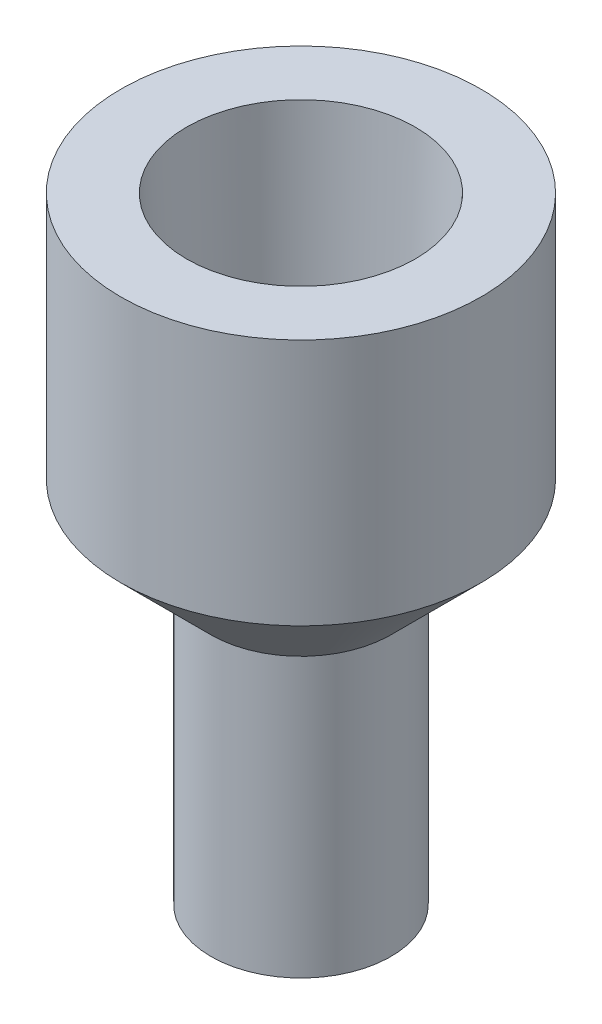
ISO-10303-21;
HEADER;
FILE_DESCRIPTION(('STEP AP214'),'2;1');
FILE_NAME('part.step','',(''),(''),'','','');
FILE_SCHEMA(('AUTOMOTIVE_DESIGN { 1 0 10303 214 1 1 1 1 }'));
ENDSEC;
DATA;
#1=APPLICATION_CONTEXT('core data for automotive mechanical design processes');
#2=APPLICATION_PROTOCOL_DEFINITION('international standard','automotive_design',2000,#1);
#3=PRODUCT_CONTEXT('',#1,'mechanical');
#4=PRODUCT('Part','Part','',(#3));
#5=PRODUCT_RELATED_PRODUCT_CATEGORY('part','',(#4));
#6=PRODUCT_DEFINITION_FORMATION('','',#4);
#7=PRODUCT_DEFINITION_CONTEXT('part definition',#1,'design');
#8=PRODUCT_DEFINITION('design','',#6,#7);
#9=PRODUCT_DEFINITION_SHAPE('','',#8);
#10=(LENGTH_UNIT() NAMED_UNIT(*) SI_UNIT(.MILLI.,.METRE.));
#11=(NAMED_UNIT(*) PLANE_ANGLE_UNIT() SI_UNIT($,.RADIAN.));
#12=(NAMED_UNIT(*) SI_UNIT($,.STERADIAN.) SOLID_ANGLE_UNIT());
#13=UNCERTAINTY_MEASURE_WITH_UNIT(LENGTH_MEASURE(1.E-05),#10,'distance_accuracy_value','');
#14=(GEOMETRIC_REPRESENTATION_CONTEXT(3) GLOBAL_UNCERTAINTY_ASSIGNED_CONTEXT((#13)) GLOBAL_UNIT_ASSIGNED_CONTEXT((#10,
#11,#12)) REPRESENTATION_CONTEXT('',''));
#15=CARTESIAN_POINT('',(0.,0.,0.));
#16=DIRECTION('',(0.,0.,1.));
#17=DIRECTION('',(1.,0.,0.));
#18=AXIS2_PLACEMENT_3D('',#15,#16,#17);
#19=CARTESIAN_POINT('',(0.,20.8,0.));
#20=DIRECTION('',(0.,-1.,0.));
#21=DIRECTION('',(0.,0.,-1.));
#22=AXIS2_PLACEMENT_3D('',#19,#20,#21);
#23=CYLINDRICAL_SURFACE('',#22,5.08);
#24=CARTESIAN_POINT('',(0.,15.72,0.));
#25=DIRECTION('',(0.,1.,0.));
#26=DIRECTION('',(0.,0.,1.));
#27=AXIS2_PLACEMENT_3D('',#24,#25,#26);
#28=CIRCLE('',#27,5.08);
#29=CARTESIAN_POINT('',(0.,15.72,5.08));
#30=VERTEX_POINT('',#29);
#31=EDGE_CURVE('E12',#30,#30,#28,.F.);
#32=ORIENTED_EDGE('',*,*,#31,.T.);
#33=EDGE_LOOP('',(#32));
#34=FACE_BOUND('',#33,.T.);
#35=CARTESIAN_POINT('',(0.,0.,0.));
#36=DIRECTION('',(0.,1.,0.));
#37=DIRECTION('',(0.,0.,1.));
#38=AXIS2_PLACEMENT_3D('',#35,#36,#37);
#39=CIRCLE('',#38,5.08);
#40=CARTESIAN_POINT('',(0.,0.,5.08));
#41=VERTEX_POINT('',#40);
#42=EDGE_CURVE('E57',#41,#41,#39,.T.);
#43=ORIENTED_EDGE('',*,*,#42,.T.);
#44=EDGE_LOOP('',(#43));
#45=FACE_BOUND('',#44,.T.);
#46=ADVANCED_FACE('F45',(#34,#45),#23,.T.);
#47=CARTESIAN_POINT('',(0.,0.,0.));
#48=DIRECTION('',(0.,1.,0.));
#49=DIRECTION('',(0.,0.,1.));
#50=AXIS2_PLACEMENT_3D('',#47,#48,#49);
#51=PLANE('',#50);
#52=CARTESIAN_POINT('',(2.18260207370534,1.20419674232153E-12,-1.26959567889035));
#53=CARTESIAN_POINT('',(3.28468433257012,9.67008055162028E-13,0.625028778003294));
#54=CARTESIAN_POINT('',(2.19184560084966,8.66555561043278E-13,2.52499999999999));
#55=CARTESIAN_POINT('',(-2.19184560084966,8.66555561043278E-13,2.52499999999999));
#56=CARTESIAN_POINT('',(-3.28468433257012,9.67008055162028E-13,0.625028778003295));
#57=CARTESIAN_POINT('',(-2.18260207370534,1.20419674232153E-12,-1.26959567889035));
#58=(BOUNDED_CURVE() B_SPLINE_CURVE(3,(#52,#53,#54,#55,#56,#57),.UNSPECIFIED.,.F.,
.F.) B_SPLINE_CURVE_WITH_KNOTS((4,2,4),(0.,0.5,1.),
.UNSPECIFIED.) CURVE() GEOMETRIC_REPRESENTATION_ITEM() RATIONAL_B_SPLINE_CURVE((1.,
0.443194600138308,0.295047331089748,0.295047331089748,0.443194600138308,1.)) REPRESENTATION_ITEM(''));
#59=CARTESIAN_POINT('',(2.18260207370538,0.,-1.26959567889033));
#60=VERTEX_POINT('',#59);
#61=CARTESIAN_POINT('',(-2.18260207370538,0.,-1.26959567889033));
#62=VERTEX_POINT('',#61);
#63=EDGE_CURVE('E88',#60,#62,#58,.T.);
#64=ORIENTED_EDGE('',*,*,#63,.F.);
#65=CARTESIAN_POINT('',(-2.18260207370538,0.,-1.26959567889033));
#66=CARTESIAN_POINT('',(-2.09114919708777,0.,-1.42681521064422));
#67=CARTESIAN_POINT('',(-1.97675252213919,0.,-1.58421046375606));
#68=CARTESIAN_POINT('',(-1.69667340355154,0.,-1.88110943034653));
#69=CARTESIAN_POINT('',(-1.53080933924127,0.,-2.02045287419984));
#70=CARTESIAN_POINT('',(-1.15199054069315,0.,-2.25799132950598));
#71=CARTESIAN_POINT('',(-0.93900759209786,0.,-2.35587177303943));
#72=CARTESIAN_POINT('',(-0.483917031615571,0.,-2.4895162934863));
#73=CARTESIAN_POINT('',(-0.242057859056617,0.,-2.525));
#74=CARTESIAN_POINT('',(0.242057859056616,0.,-2.525));
#75=CARTESIAN_POINT('',(0.483917031615571,0.,-2.4895162934863));
#76=CARTESIAN_POINT('',(0.93900759209786,0.,-2.35587177303943));
#77=CARTESIAN_POINT('',(1.15199054069315,0.,-2.25799132950598));
#78=CARTESIAN_POINT('',(1.53080933924127,0.,-2.02045287419984));
#79=CARTESIAN_POINT('',(1.69667340355154,0.,-1.88110943034653));
#80=CARTESIAN_POINT('',(1.97675252213918,0.,-1.58421046375606));
#81=CARTESIAN_POINT('',(2.09114919708777,0.,-1.42681521064422));
#82=CARTESIAN_POINT('',(2.18260207370538,0.,-1.26959567889033));
#83=B_SPLINE_CURVE_WITH_KNOTS('',3,(#65,#66,#67,#68,#69,#70,#71,#72,#73,#74,#75,#76,#77,#78,#79,
#80,#81,#82),.UNSPECIFIED.,.F.,.F.,(4,2,2,2,2,2,2,2,4),(0.,0.125,0.25,0.375,0.5,0.625,0.75,
0.875,1.),.UNSPECIFIED.);
#84=EDGE_CURVE('E85',#62,#60,#83,.T.);
#85=ORIENTED_EDGE('',*,*,#84,.F.);
#86=EDGE_LOOP('',(#64,#85));
#87=FACE_BOUND('',#86,.T.);
#88=ORIENTED_EDGE('',*,*,#42,.F.);
#89=EDGE_LOOP('',(#88));
#90=FACE_BOUND('',#89,.T.);
#91=ADVANCED_FACE('F223',(#87,#90),#51,.F.);
#92=CARTESIAN_POINT('',(0.,34.77,0.));
#93=DIRECTION('',(0.,-1.,0.));
#94=DIRECTION('',(0.,0.,-1.));
#95=AXIS2_PLACEMENT_3D('',#92,#93,#94);
#96=CYLINDRICAL_SURFACE('',#95,10.16);
#97=CARTESIAN_POINT('',(0.,34.77,0.));
#98=DIRECTION('',(0.,1.,0.));
#99=DIRECTION('',(0.,0.,1.));
#100=AXIS2_PLACEMENT_3D('',#97,#98,#99);
#101=CIRCLE('',#100,10.16);
#102=CARTESIAN_POINT('',(0.,34.77,10.16));
#103=VERTEX_POINT('',#102);
#104=EDGE_CURVE('E212',#103,#103,#101,.T.);
#105=ORIENTED_EDGE('',*,*,#104,.F.);
#106=EDGE_LOOP('',(#105));
#107=FACE_BOUND('',#106,.T.);
#108=CARTESIAN_POINT('',(0.,20.8,0.));
#109=DIRECTION('',(0.,1.,0.));
#110=DIRECTION('',(0.,0.,1.));
#111=AXIS2_PLACEMENT_3D('',#108,#109,#110);
#112=CIRCLE('',#111,10.16);
#113=CARTESIAN_POINT('',(0.,20.8,10.16));
#114=VERTEX_POINT('',#113);
#115=EDGE_CURVE('E211',#114,#114,#112,.T.);
#116=ORIENTED_EDGE('',*,*,#115,.T.);
#117=EDGE_LOOP('',(#116));
#118=FACE_BOUND('',#117,.T.);
#119=ADVANCED_FACE('F232',(#107,#118),#96,.T.);
#120=CARTESIAN_POINT('',(0.,34.77,0.));
#121=DIRECTION('',(0.,1.,0.));
#122=DIRECTION('',(0.,0.,1.));
#123=AXIS2_PLACEMENT_3D('',#120,#121,#122);
#124=PLANE('',#123);
#125=CARTESIAN_POINT('',(0.,34.77,0.));
#126=DIRECTION('',(0.,1.,0.));
#127=DIRECTION('',(0.,0.,1.));
#128=AXIS2_PLACEMENT_3D('',#125,#126,#127);
#129=CIRCLE('',#128,6.450000054);
#130=CARTESIAN_POINT('',(0.,34.77,6.450000054));
#131=VERTEX_POINT('',#130);
#132=EDGE_CURVE('E206',#131,#131,#129,.T.);
#133=ORIENTED_EDGE('',*,*,#132,.F.);
#134=EDGE_LOOP('',(#133));
#135=FACE_BOUND('',#134,.T.);
#136=ORIENTED_EDGE('',*,*,#104,.T.);
#137=EDGE_LOOP('',(#136));
#138=FACE_BOUND('',#137,.T.);
#139=ADVANCED_FACE('F187',(#135,#138),#124,.T.);
#140=CARTESIAN_POINT('',(0.,23.34,0.));
#141=DIRECTION('',(0.,-1.,0.));
#142=DIRECTION('',(0.,0.,-1.));
#143=AXIS2_PLACEMENT_3D('',#140,#141,#142);
#144=PLANE('',#143);
#145=CARTESIAN_POINT('',(0.,23.34,0.));
#146=DIRECTION('',(0.,-1.,0.));
#147=DIRECTION('',(0.,0.,-1.));
#148=AXIS2_PLACEMENT_3D('',#145,#146,#147);
#149=CIRCLE('',#148,6.05215787881266);
#150=CARTESIAN_POINT('',(0.,23.34,-6.05215787881266));
#151=VERTEX_POINT('',#150);
#152=EDGE_CURVE('E198',#151,#151,#149,.T.);
#153=ORIENTED_EDGE('',*,*,#152,.F.);
#154=EDGE_LOOP('',(#153));
#155=FACE_BOUND('',#154,.T.);
#156=ADVANCED_FACE('F122',(#155),#144,.F.);
#157=CARTESIAN_POINT('',(0.,23.34,0.));
#158=DIRECTION('',(0.,1.,0.));
#159=DIRECTION('',(0.,0.,1.));
#160=AXIS2_PLACEMENT_3D('',#157,#158,#159);
#161=CONICAL_SURFACE('',#160,6.05215787881266,0.0347927933343152);
#162=ORIENTED_EDGE('',*,*,#152,.T.);
#163=EDGE_LOOP('',(#162));
#164=FACE_BOUND('',#163,.T.);
#165=ORIENTED_EDGE('',*,*,#132,.T.);
#166=EDGE_LOOP('',(#165));
#167=FACE_BOUND('',#166,.T.);
#168=ADVANCED_FACE('F186',(#164,#167),#161,.F.);
#169=CARTESIAN_POINT('',(0.,20.8,0.));
#170=DIRECTION('',(0.,1.,0.));
#171=DIRECTION('',(0.,0.,1.));
#172=AXIS2_PLACEMENT_3D('',#169,#170,#171);
#173=CONICAL_SURFACE('',#172,10.16,0.785398163397453);
#174=ORIENTED_EDGE('',*,*,#31,.F.);
#175=EDGE_LOOP('',(#174));
#176=FACE_BOUND('',#175,.T.);
#177=ORIENTED_EDGE('',*,*,#115,.F.);
#178=EDGE_LOOP('',(#177));
#179=FACE_BOUND('',#178,.T.);
#180=ADVANCED_FACE('F48',(#176,#179),#173,.T.);
#181=CARTESIAN_POINT('',(0.,18.26,0.));
#182=DIRECTION('',(0.,-1.,0.));
#183=DIRECTION('',(0.,0.,-1.));
#184=AXIS2_PLACEMENT_3D('',#181,#182,#183);
#185=PLANE('',#184);
#186=CARTESIAN_POINT('',(-1.68689794403966,18.2599999999426,-1.60000010199896));
#187=CARTESIAN_POINT('',(-3.32959908570239,18.2599999999286,0.131918024181421));
#188=CARTESIAN_POINT('',(-2.38704994430589,18.2599999999203,2.32500000000087));
#189=CARTESIAN_POINT('',(2.38704994430589,18.2599999999203,2.32500000000087));
#190=CARTESIAN_POINT('',(3.32959908570239,18.2599999999286,0.13191802418142));
#191=CARTESIAN_POINT('',(1.68689794403966,18.2599999999426,-1.60000010199896));
#192=(BOUNDED_CURVE() B_SPLINE_CURVE(3,(#186,#187,#188,#189,#190,#191),.UNSPECIFIED.,.F.,
.F.) B_SPLINE_CURVE_WITH_KNOTS((4,2,4),(0.,0.5,1.),
.UNSPECIFIED.) CURVE() GEOMETRIC_REPRESENTATION_ITEM() RATIONAL_B_SPLINE_CURVE((1.,
0.355899275655038,0.212319878090855,0.212319878090855,0.355899275655038,1.)) REPRESENTATION_ITEM(''));
#193=CARTESIAN_POINT('',(1.68689794403811,18.26,-1.600000102));
#194=VERTEX_POINT('',#193);
#195=CARTESIAN_POINT('',(-1.68689794403811,18.26,-1.600000102));
#196=VERTEX_POINT('',#195);
#197=EDGE_CURVE('E94',#194,#196,#192,.F.);
#198=ORIENTED_EDGE('',*,*,#197,.T.);
#199=CARTESIAN_POINT('',(1.68689794403811,18.26,-1.600000102));
#200=CARTESIAN_POINT('',(1.54632311536826,18.26,-1.600000102));
#201=CARTESIAN_POINT('',(1.40574828669842,18.26,-1.600000102));
#202=CARTESIAN_POINT('',(1.12459862935874,18.26,-1.600000102));
#203=CARTESIAN_POINT('',(0.984023800688896,18.26,-1.600000102));
#204=CARTESIAN_POINT('',(0.702874143349211,18.26,-1.600000102));
#205=CARTESIAN_POINT('',(0.562299314679369,18.26,-1.600000102));
#206=CARTESIAN_POINT('',(0.281149657339685,18.26,-1.600000102));
#207=CARTESIAN_POINT('',(0.140574828669843,18.26,-1.600000102));
#208=CARTESIAN_POINT('',(-0.140574828669842,18.26,-1.600000102));
#209=CARTESIAN_POINT('',(-0.281149657339684,18.26,-1.600000102));
#210=CARTESIAN_POINT('',(-0.562299314679369,18.26,-1.600000102));
#211=CARTESIAN_POINT('',(-0.702874143349211,18.26,-1.600000102));
#212=CARTESIAN_POINT('',(-0.984023800688896,18.26,-1.600000102));
#213=CARTESIAN_POINT('',(-1.12459862935874,18.26,-1.600000102));
#214=CARTESIAN_POINT('',(-1.40574828669842,18.26,-1.600000102));
#215=CARTESIAN_POINT('',(-1.54632311536826,18.26,-1.600000102));
#216=CARTESIAN_POINT('',(-1.68689794403811,18.26,-1.600000102));
#217=B_SPLINE_CURVE_WITH_KNOTS('',3,(#199,#200,#201,#202,#203,#204,#205,#206,#207,#208,#209,
#210,#211,#212,#213,#214,#215,#216),.UNSPECIFIED.,.F.,.F.,(4,2,2,2,2,2,2,2,4),(0.,0.125,0.25,
0.375,0.5,0.625,0.75,0.875,1.),.UNSPECIFIED.);
#218=EDGE_CURVE('E81',#196,#194,#217,.F.);
#219=ORIENTED_EDGE('',*,*,#218,.T.);
#220=EDGE_LOOP('',(#198,#219));
#221=FACE_BOUND('',#220,.T.);
#222=ADVANCED_FACE('F93',(#221),#185,.T.);
#223=CARTESIAN_POINT('',(-1.68689794403811,18.26,-1.600000102));
#224=CARTESIAN_POINT('',(-2.18260207370538,0.,-1.26959567889033));
#225=CARTESIAN_POINT('',(-1.54632311536826,18.26,-1.600000102));
#226=CARTESIAN_POINT('',(-2.09114919708777,0.,-1.42681521064422));
#227=CARTESIAN_POINT('',(-1.40574828669842,18.26,-1.600000102));
#228=CARTESIAN_POINT('',(-1.97675252213919,0.,-1.58421046375606));
#229=CARTESIAN_POINT('',(-1.12459862935874,18.26,-1.600000102));
#230=CARTESIAN_POINT('',(-1.69667340355154,0.,-1.88110943034653));
#231=CARTESIAN_POINT('',(-0.984023800688896,18.26,-1.600000102));
#232=CARTESIAN_POINT('',(-1.53080933924127,0.,-2.02045287419984));
#233=CARTESIAN_POINT('',(-0.702874143349211,18.26,-1.600000102));
#234=CARTESIAN_POINT('',(-1.15199054069315,0.,-2.25799132950598));
#235=CARTESIAN_POINT('',(-0.562299314679369,18.26,-1.600000102));
#236=CARTESIAN_POINT('',(-0.93900759209786,0.,-2.35587177303943));
#237=CARTESIAN_POINT('',(-0.281149657339684,18.26,-1.600000102));
#238=CARTESIAN_POINT('',(-0.483917031615571,0.,-2.4895162934863));
#239=CARTESIAN_POINT('',(-0.140574828669842,18.26,-1.600000102));
#240=CARTESIAN_POINT('',(-0.242057859056617,0.,-2.525));
#241=CARTESIAN_POINT('',(0.140574828669843,18.26,-1.600000102));
#242=CARTESIAN_POINT('',(0.242057859056616,0.,-2.525));
#243=CARTESIAN_POINT('',(0.281149657339685,18.26,-1.600000102));
#244=CARTESIAN_POINT('',(0.483917031615571,0.,-2.4895162934863));
#245=CARTESIAN_POINT('',(0.562299314679369,18.26,-1.600000102));
#246=CARTESIAN_POINT('',(0.93900759209786,0.,-2.35587177303943));
#247=CARTESIAN_POINT('',(0.702874143349211,18.26,-1.600000102));
#248=CARTESIAN_POINT('',(1.15199054069315,0.,-2.25799132950598));
#249=CARTESIAN_POINT('',(0.984023800688896,18.26,-1.600000102));
#250=CARTESIAN_POINT('',(1.53080933924127,0.,-2.02045287419984));
#251=CARTESIAN_POINT('',(1.12459862935874,18.26,-1.600000102));
#252=CARTESIAN_POINT('',(1.69667340355154,0.,-1.88110943034653));
#253=CARTESIAN_POINT('',(1.40574828669842,18.26,-1.600000102));
#254=CARTESIAN_POINT('',(1.97675252213918,0.,-1.58421046375606));
#255=CARTESIAN_POINT('',(1.54632311536826,18.26,-1.600000102));
#256=CARTESIAN_POINT('',(2.09114919708777,0.,-1.42681521064422));
#257=CARTESIAN_POINT('',(1.68689794403811,18.26,-1.600000102));
#258=CARTESIAN_POINT('',(2.18260207370538,0.,-1.26959567889033));
#259=B_SPLINE_SURFACE_WITH_KNOTS('',3,1,((#223,#224),(#225,#226),(#227,#228),(#229,#230),(#231,
#232),(#233,#234),(#235,#236),(#237,#238),(#239,#240),(#241,#242),(#243,#244),(#245,#246),(#247,
#248),(#249,#250),(#251,#252),(#253,#254),(#255,#256),(#257,#258)),.UNSPECIFIED.,.F.,.F.,.F.,(4,
2,2,2,2,2,2,2,4),(2,2),(0.,0.125,0.25,0.375,0.5,0.625,0.75,0.875,1.),(0.,1.),.UNSPECIFIED.);
#260=CARTESIAN_POINT('',(-2.18260207370538,0.,-1.26959567889033));
#261=CARTESIAN_POINT('',(-1.68689794403811,18.26,-1.600000102));
#262=(BOUNDED_CURVE() B_SPLINE_CURVE(1,(#260,#261),.UNSPECIFIED.,.F.,
.F.) B_SPLINE_CURVE_WITH_KNOTS((2,2),(0.,1.),
.UNSPECIFIED.) CURVE() GEOMETRIC_REPRESENTATION_ITEM() RATIONAL_B_SPLINE_CURVE((1.,1.)) REPRESENTATION_ITEM(''));
#263=EDGE_CURVE('E73',#62,#196,#262,.T.);
#264=CARTESIAN_POINT('',(1.68689794403811,18.26,-1.600000102));
#265=CARTESIAN_POINT('',(2.18260207370538,0.,-1.26959567889033));
#266=(BOUNDED_CURVE() B_SPLINE_CURVE(1,(#264,#265),.UNSPECIFIED.,.F.,
.F.) B_SPLINE_CURVE_WITH_KNOTS((2,2),(0.,1.),
.UNSPECIFIED.) CURVE() GEOMETRIC_REPRESENTATION_ITEM() RATIONAL_B_SPLINE_CURVE((1.,1.)) REPRESENTATION_ITEM(''));
#267=EDGE_CURVE('E65',#194,#60,#266,.T.);
#268=ORIENTED_EDGE('',*,*,#218,.F.);
#269=ORIENTED_EDGE('',*,*,#263,.F.);
#270=ORIENTED_EDGE('',*,*,#84,.T.);
#271=ORIENTED_EDGE('',*,*,#267,.F.);
#272=EDGE_LOOP('',(#268,#269,#270,#271));
#273=FACE_BOUND('',#272,.T.);
#274=ADVANCED_FACE('F80',(#273),#259,.F.);
#275=CARTESIAN_POINT('',(1.68689794403811,18.26,-1.600000102));
#276=CARTESIAN_POINT('',(2.18260207370538,0.,-1.26959567889033));
#277=CARTESIAN_POINT('',(3.32959908570257,18.26,0.131918024179491));
#278=CARTESIAN_POINT('',(3.28468433257012,0.,0.62502877800332));
#279=CARTESIAN_POINT('',(2.38704994430674,18.26,2.325));
#280=CARTESIAN_POINT('',(2.19184560084965,0.,2.525));
#281=CARTESIAN_POINT('',(-2.38704994430674,18.26,2.325));
#282=CARTESIAN_POINT('',(-2.19184560084965,0.,2.525));
#283=CARTESIAN_POINT('',(-3.32959908570257,18.26,0.131918024179491));
#284=CARTESIAN_POINT('',(-3.28468433257012,0.,0.625028778003321));
#285=CARTESIAN_POINT('',(-1.68689794403811,18.26,-1.600000102));
#286=CARTESIAN_POINT('',(-2.18260207370538,0.,-1.26959567889033));
#287=(BOUNDED_SURFACE() B_SPLINE_SURFACE(3,1,((#275,#276),(#277,#278),(#279,#280),(#281,#282),
(#283,#284),(#285,#286)),.UNSPECIFIED.,.F.,.F.,.F.) B_SPLINE_SURFACE_WITH_KNOTS((4,2,4),(2,2),
(0.,0.5,1.),(0.,1.),
.UNSPECIFIED.) GEOMETRIC_REPRESENTATION_ITEM() RATIONAL_B_SPLINE_SURFACE(((1.,1.),
(0.355899275654764,0.443194600138314),(0.212319878090595,0.295047331089753),(0.212319878090595,
0.295047331089753),(0.355899275654764,0.443194600138314),(1.,1.))) REPRESENTATION_ITEM('') SURFACE());
#288=ORIENTED_EDGE('',*,*,#197,.F.);
#289=ORIENTED_EDGE('',*,*,#267,.T.);
#290=ORIENTED_EDGE('',*,*,#63,.T.);
#291=ORIENTED_EDGE('',*,*,#263,.T.);
#292=EDGE_LOOP('',(#288,#289,#290,#291));
#293=FACE_BOUND('',#292,.T.);
#294=ADVANCED_FACE('F99',(#293),#287,.F.);
#295=CLOSED_SHELL('',(#46,#91,#119,#139,#156,#168,#180,#222,#274,#294));
#296=MANIFOLD_SOLID_BREP('B2',#295);
#297=ADVANCED_BREP_SHAPE_REPRESENTATION('',(#18,#296),#14);
#298=SHAPE_DEFINITION_REPRESENTATION(#9,#297);
ENDSEC;
END-ISO-10303-21;
